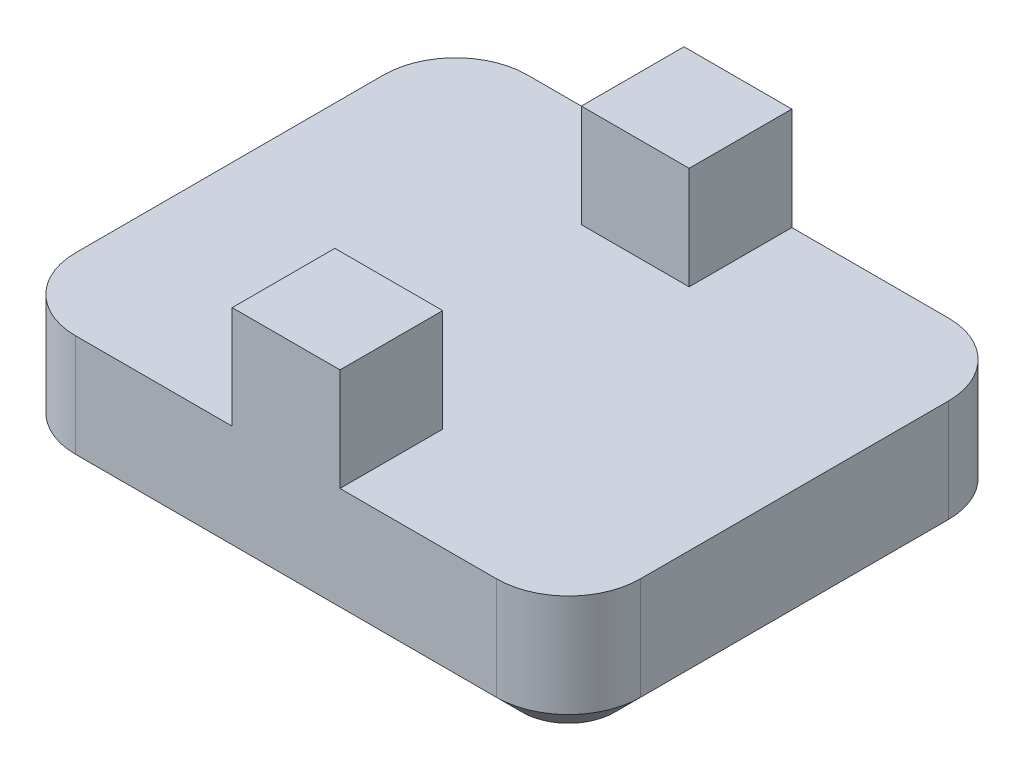
ISO-10303-21;
HEADER;
FILE_DESCRIPTION(('STEP AP214'),'2;1');
FILE_NAME('part.step','',(''),(''),'','','');
FILE_SCHEMA(('AUTOMOTIVE_DESIGN { 1 0 10303 214 1 1 1 1 }'));
ENDSEC;
DATA;
#1=APPLICATION_CONTEXT('core data for automotive mechanical design processes');
#2=APPLICATION_PROTOCOL_DEFINITION('international standard','automotive_design',2000,#1);
#3=PRODUCT_CONTEXT('',#1,'mechanical');
#4=PRODUCT('Part','Part','',(#3));
#5=PRODUCT_RELATED_PRODUCT_CATEGORY('part','',(#4));
#6=PRODUCT_DEFINITION_FORMATION('','',#4);
#7=PRODUCT_DEFINITION_CONTEXT('part definition',#1,'design');
#8=PRODUCT_DEFINITION('design','',#6,#7);
#9=PRODUCT_DEFINITION_SHAPE('','',#8);
#10=(LENGTH_UNIT() NAMED_UNIT(*) SI_UNIT(.MILLI.,.METRE.));
#11=(NAMED_UNIT(*) PLANE_ANGLE_UNIT() SI_UNIT($,.RADIAN.));
#12=(NAMED_UNIT(*) SI_UNIT($,.STERADIAN.) SOLID_ANGLE_UNIT());
#13=UNCERTAINTY_MEASURE_WITH_UNIT(LENGTH_MEASURE(1.E-05),#10,'distance_accuracy_value','');
#14=(GEOMETRIC_REPRESENTATION_CONTEXT(3) GLOBAL_UNCERTAINTY_ASSIGNED_CONTEXT((#13)) GLOBAL_UNIT_ASSIGNED_CONTEXT((#10,
#11,#12)) REPRESENTATION_CONTEXT('',''));
#15=CARTESIAN_POINT('',(0.,0.,0.));
#16=DIRECTION('',(0.,0.,1.));
#17=DIRECTION('',(1.,0.,0.));
#18=AXIS2_PLACEMENT_3D('',#15,#16,#17);
#19=CARTESIAN_POINT('',(-44.9928014289941,2.5,14.3871731803003));
#20=DIRECTION('',(0.,-1.,0.));
#21=DIRECTION('',(0.,0.,-1.));
#22=AXIS2_PLACEMENT_3D('',#19,#20,#21);
#23=CYLINDRICAL_SURFACE('',#22,1.4);
#24=DIRECTION('',(0.,-1.,0.));
#25=VECTOR('',#24,1.);
#26=CARTESIAN_POINT('',(-44.9928014289941,2.5,15.7871731803003));
#27=LINE('',#26,#25);
#28=CARTESIAN_POINT('',(-44.9928014289941,2.5,15.7871731803003));
#29=VERTEX_POINT('',#28);
#30=CARTESIAN_POINT('',(-44.9928014289941,0.5,15.7871731803003));
#31=VERTEX_POINT('',#30);
#32=EDGE_CURVE('E258',#29,#31,#27,.T.);
#33=ORIENTED_EDGE('',*,*,#32,.T.);
#34=CARTESIAN_POINT('',(-44.9928014289941,0.5,14.3871731803003));
#35=DIRECTION('',(0.,1.,0.));
#36=DIRECTION('',(0.,0.,1.));
#37=AXIS2_PLACEMENT_3D('',#34,#35,#36);
#38=CIRCLE('',#37,1.4);
#39=CARTESIAN_POINT('',(-43.5928014289941,0.5,14.3871731803003));
#40=VERTEX_POINT('',#39);
#41=EDGE_CURVE('E53',#31,#40,#38,.T.);
#42=ORIENTED_EDGE('',*,*,#41,.T.);
#43=DIRECTION('',(0.,-1.,0.));
#44=VECTOR('',#43,1.);
#45=CARTESIAN_POINT('',(-43.5928014289941,2.5,14.3871731803003));
#46=LINE('',#45,#44);
#47=CARTESIAN_POINT('',(-43.5928014289941,2.5,14.3871731803003));
#48=VERTEX_POINT('',#47);
#49=EDGE_CURVE('E279',#48,#40,#46,.T.);
#50=ORIENTED_EDGE('',*,*,#49,.F.);
#51=CARTESIAN_POINT('',(-44.9928014289941,2.5,14.3871731803003));
#52=DIRECTION('',(0.,1.,0.));
#53=DIRECTION('',(0.,0.,1.));
#54=AXIS2_PLACEMENT_3D('',#51,#52,#53);
#55=CIRCLE('',#54,1.4);
#56=EDGE_CURVE('E239',#29,#48,#55,.T.);
#57=ORIENTED_EDGE('',*,*,#56,.F.);
#58=EDGE_LOOP('',(#33,#42,#50,#57));
#59=FACE_BOUND('',#58,.T.);
#60=ADVANCED_FACE('F43',(#59),#23,.T.);
#61=CARTESIAN_POINT('',(-43.592801428994,2.5,8.38717318030035));
#62=DIRECTION('',(-1.,0.,0.));
#63=DIRECTION('',(0.,0.,1.));
#64=AXIS2_PLACEMENT_3D('',#61,#62,#63);
#65=PLANE('',#64);
#66=ORIENTED_EDGE('',*,*,#49,.T.);
#67=DIRECTION('',(0.,0.,-1.));
#68=VECTOR('',#67,1.);
#69=CARTESIAN_POINT('',(-43.592801428994,0.5,8.38717318030035));
#70=LINE('',#69,#68);
#71=CARTESIAN_POINT('',(-43.592801428994,0.5,8.38717318030035));
#72=VERTEX_POINT('',#71);
#73=EDGE_CURVE('E308',#40,#72,#70,.T.);
#74=ORIENTED_EDGE('',*,*,#73,.T.);
#75=DIRECTION('',(0.,-1.,0.));
#76=VECTOR('',#75,1.);
#77=CARTESIAN_POINT('',(-43.592801428994,2.5,8.38717318030035));
#78=LINE('',#77,#76);
#79=CARTESIAN_POINT('',(-43.592801428994,2.5,8.38717318030035));
#80=VERTEX_POINT('',#79);
#81=EDGE_CURVE('E276',#80,#72,#78,.T.);
#82=ORIENTED_EDGE('',*,*,#81,.F.);
#83=DIRECTION('',(0.,0.,-1.));
#84=VECTOR('',#83,1.);
#85=CARTESIAN_POINT('',(-43.592801428994,2.5,8.38717318030035));
#86=LINE('',#85,#84);
#87=EDGE_CURVE('E242',#48,#80,#86,.T.);
#88=ORIENTED_EDGE('',*,*,#87,.F.);
#89=EDGE_LOOP('',(#66,#74,#82,#88));
#90=FACE_BOUND('',#89,.T.);
#91=ADVANCED_FACE('F414',(#90),#65,.F.);
#92=CARTESIAN_POINT('',(-44.992801428994,2.5,8.38717318030035));
#93=DIRECTION('',(0.,-1.,0.));
#94=DIRECTION('',(0.,0.,-1.));
#95=AXIS2_PLACEMENT_3D('',#92,#93,#94);
#96=CYLINDRICAL_SURFACE('',#95,1.4);
#97=ORIENTED_EDGE('',*,*,#81,.T.);
#98=CARTESIAN_POINT('',(-44.992801428994,0.5,8.38717318030035));
#99=DIRECTION('',(0.,1.,0.));
#100=DIRECTION('',(0.,0.,1.));
#101=AXIS2_PLACEMENT_3D('',#98,#99,#100);
#102=CIRCLE('',#101,1.4);
#103=CARTESIAN_POINT('',(-44.992801428994,0.5,6.98717318030034));
#104=VERTEX_POINT('',#103);
#105=EDGE_CURVE('E304',#72,#104,#102,.T.);
#106=ORIENTED_EDGE('',*,*,#105,.T.);
#107=DIRECTION('',(0.,-1.,0.));
#108=VECTOR('',#107,1.);
#109=CARTESIAN_POINT('',(-44.992801428994,2.5,6.98717318030034));
#110=LINE('',#109,#108);
#111=CARTESIAN_POINT('',(-44.992801428994,2.5,6.98717318030034));
#112=VERTEX_POINT('',#111);
#113=EDGE_CURVE('E273',#112,#104,#110,.T.);
#114=ORIENTED_EDGE('',*,*,#113,.F.);
#115=CARTESIAN_POINT('',(-44.992801428994,2.5,8.38717318030035));
#116=DIRECTION('',(0.,1.,0.));
#117=DIRECTION('',(0.,0.,-1.));
#118=AXIS2_PLACEMENT_3D('',#115,#116,#117);
#119=CIRCLE('',#118,1.4);
#120=EDGE_CURVE('E244',#80,#112,#119,.T.);
#121=ORIENTED_EDGE('',*,*,#120,.F.);
#122=EDGE_LOOP('',(#97,#106,#114,#121));
#123=FACE_BOUND('',#122,.T.);
#124=ADVANCED_FACE('F357',(#123),#96,.T.);
#125=CARTESIAN_POINT('',(-53.192801428994,2.5,6.98717318030034));
#126=DIRECTION('',(0.,0.,1.));
#127=DIRECTION('',(1.,0.,0.));
#128=AXIS2_PLACEMENT_3D('',#125,#126,#127);
#129=PLANE('',#128);
#130=ORIENTED_EDGE('',*,*,#113,.T.);
#131=DIRECTION('',(-1.,0.,0.));
#132=VECTOR('',#131,1.);
#133=CARTESIAN_POINT('',(-53.192801428994,0.5,6.98717318030034));
#134=LINE('',#133,#132);
#135=CARTESIAN_POINT('',(-53.192801428994,0.5,6.98717318030035));
#136=VERTEX_POINT('',#135);
#137=EDGE_CURVE('E282',#104,#136,#134,.T.);
#138=ORIENTED_EDGE('',*,*,#137,.T.);
#139=DIRECTION('',(0.,-1.,0.));
#140=VECTOR('',#139,1.);
#141=CARTESIAN_POINT('',(-53.192801428994,2.5,6.98717318030035));
#142=LINE('',#141,#140);
#143=CARTESIAN_POINT('',(-53.192801428994,2.5,6.98717318030035));
#144=VERTEX_POINT('',#143);
#145=EDGE_CURVE('E270',#144,#136,#142,.T.);
#146=ORIENTED_EDGE('',*,*,#145,.F.);
#147=DIRECTION('',(-1.,0.,0.));
#148=VECTOR('',#147,1.);
#149=CARTESIAN_POINT('',(-53.192801428994,2.5,6.98717318030034));
#150=LINE('',#149,#148);
#151=CARTESIAN_POINT('',(-50.142801428994,2.5,6.98717318030034));
#152=VERTEX_POINT('',#151);
#153=EDGE_CURVE('E246',#152,#144,#150,.T.);
#154=ORIENTED_EDGE('',*,*,#153,.F.);
#155=DIRECTION('',(0.,-1.,0.));
#156=VECTOR('',#155,1.);
#157=CARTESIAN_POINT('',(-50.142801428994,4.5,6.98717318030035));
#158=LINE('',#157,#156);
#159=CARTESIAN_POINT('',(-50.142801428994,4.5,6.98717318030035));
#160=VERTEX_POINT('',#159);
#161=EDGE_CURVE('E374',#160,#152,#158,.T.);
#162=ORIENTED_EDGE('',*,*,#161,.F.);
#163=DIRECTION('',(-1.,0.,0.));
#164=VECTOR('',#163,1.);
#165=CARTESIAN_POINT('',(-50.142801428994,4.5,6.98717318030035));
#166=LINE('',#165,#164);
#167=CARTESIAN_POINT('',(-48.042801428994,4.5,6.98717318030035));
#168=VERTEX_POINT('',#167);
#169=EDGE_CURVE('E196',#168,#160,#166,.T.);
#170=ORIENTED_EDGE('',*,*,#169,.F.);
#171=DIRECTION('',(0.,-1.,0.));
#172=VECTOR('',#171,1.);
#173=CARTESIAN_POINT('',(-48.042801428994,4.5,6.98717318030035));
#174=LINE('',#173,#172);
#175=CARTESIAN_POINT('',(-48.042801428994,2.5,6.98717318030034));
#176=VERTEX_POINT('',#175);
#177=EDGE_CURVE('E208',#168,#176,#174,.T.);
#178=ORIENTED_EDGE('',*,*,#177,.T.);
#179=EDGE_CURVE('E247',#112,#176,#150,.T.);
#180=ORIENTED_EDGE('',*,*,#179,.F.);
#181=EDGE_LOOP('',(#130,#138,#146,#154,#162,#170,#178,#180));
#182=FACE_BOUND('',#181,.T.);
#183=ADVANCED_FACE('F362',(#182),#129,.F.);
#184=CARTESIAN_POINT('',(-53.192801428994,2.5,8.38717318030035));
#185=DIRECTION('',(0.,-1.,0.));
#186=DIRECTION('',(0.,0.,-1.));
#187=AXIS2_PLACEMENT_3D('',#184,#185,#186);
#188=CYLINDRICAL_SURFACE('',#187,1.4);
#189=ORIENTED_EDGE('',*,*,#145,.T.);
#190=CARTESIAN_POINT('',(-53.192801428994,0.5,8.38717318030035));
#191=DIRECTION('',(0.,1.,0.));
#192=DIRECTION('',(0.,0.,1.));
#193=AXIS2_PLACEMENT_3D('',#190,#191,#192);
#194=CIRCLE('',#193,1.4);
#195=CARTESIAN_POINT('',(-54.592801428994,0.5,8.38717318030035));
#196=VERTEX_POINT('',#195);
#197=EDGE_CURVE('E302',#136,#196,#194,.T.);
#198=ORIENTED_EDGE('',*,*,#197,.T.);
#199=DIRECTION('',(0.,-1.,0.));
#200=VECTOR('',#199,1.);
#201=CARTESIAN_POINT('',(-54.592801428994,2.5,8.38717318030035));
#202=LINE('',#201,#200);
#203=CARTESIAN_POINT('',(-54.592801428994,2.5,8.38717318030035));
#204=VERTEX_POINT('',#203);
#205=EDGE_CURVE('E267',#204,#196,#202,.T.);
#206=ORIENTED_EDGE('',*,*,#205,.F.);
#207=CARTESIAN_POINT('',(-53.192801428994,2.5,8.38717318030035));
#208=DIRECTION('',(0.,1.,0.));
#209=DIRECTION('',(0.,0.,1.));
#210=AXIS2_PLACEMENT_3D('',#207,#208,#209);
#211=CIRCLE('',#210,1.4);
#212=EDGE_CURVE('E249',#144,#204,#211,.T.);
#213=ORIENTED_EDGE('',*,*,#212,.F.);
#214=EDGE_LOOP('',(#189,#198,#206,#213));
#215=FACE_BOUND('',#214,.T.);
#216=ADVANCED_FACE('F383',(#215),#188,.T.);
#217=CARTESIAN_POINT('',(-54.592801428994,2.5,8.38717318030035));
#218=DIRECTION('',(1.,0.,0.));
#219=DIRECTION('',(0.,0.,-1.));
#220=AXIS2_PLACEMENT_3D('',#217,#218,#219);
#221=PLANE('',#220);
#222=ORIENTED_EDGE('',*,*,#205,.T.);
#223=DIRECTION('',(0.,0.,1.));
#224=VECTOR('',#223,1.);
#225=CARTESIAN_POINT('',(-54.592801428994,0.5,8.38717318030035));
#226=LINE('',#225,#224);
#227=CARTESIAN_POINT('',(-54.5928014289941,0.5,14.3871731803003));
#228=VERTEX_POINT('',#227);
#229=EDGE_CURVE('E306',#196,#228,#226,.T.);
#230=ORIENTED_EDGE('',*,*,#229,.T.);
#231=DIRECTION('',(0.,-1.,0.));
#232=VECTOR('',#231,1.);
#233=CARTESIAN_POINT('',(-54.5928014289941,2.5,14.3871731803003));
#234=LINE('',#233,#232);
#235=CARTESIAN_POINT('',(-54.5928014289941,2.5,14.3871731803003));
#236=VERTEX_POINT('',#235);
#237=EDGE_CURVE('E264',#236,#228,#234,.T.);
#238=ORIENTED_EDGE('',*,*,#237,.F.);
#239=DIRECTION('',(0.,0.,1.));
#240=VECTOR('',#239,1.);
#241=CARTESIAN_POINT('',(-54.592801428994,2.5,8.38717318030035));
#242=LINE('',#241,#240);
#243=EDGE_CURVE('E251',#204,#236,#242,.T.);
#244=ORIENTED_EDGE('',*,*,#243,.F.);
#245=EDGE_LOOP('',(#222,#230,#238,#244));
#246=FACE_BOUND('',#245,.T.);
#247=ADVANCED_FACE('F387',(#246),#221,.F.);
#248=CARTESIAN_POINT('',(-53.1928014289941,2.5,14.3871731803003));
#249=DIRECTION('',(0.,-1.,0.));
#250=DIRECTION('',(0.,0.,-1.));
#251=AXIS2_PLACEMENT_3D('',#248,#249,#250);
#252=CYLINDRICAL_SURFACE('',#251,1.4);
#253=ORIENTED_EDGE('',*,*,#237,.T.);
#254=CARTESIAN_POINT('',(-53.1928014289941,0.5,14.3871731803003));
#255=DIRECTION('',(0.,1.,0.));
#256=DIRECTION('',(0.,0.,1.));
#257=AXIS2_PLACEMENT_3D('',#254,#255,#256);
#258=CIRCLE('',#257,1.4);
#259=CARTESIAN_POINT('',(-53.1928014289941,0.5,15.7871731803003));
#260=VERTEX_POINT('',#259);
#261=EDGE_CURVE('E310',#228,#260,#258,.T.);
#262=ORIENTED_EDGE('',*,*,#261,.T.);
#263=DIRECTION('',(0.,-1.,0.));
#264=VECTOR('',#263,1.);
#265=CARTESIAN_POINT('',(-53.1928014289941,2.5,15.7871731803003));
#266=LINE('',#265,#264);
#267=CARTESIAN_POINT('',(-53.1928014289941,2.5,15.7871731803003));
#268=VERTEX_POINT('',#267);
#269=EDGE_CURVE('E261',#268,#260,#266,.T.);
#270=ORIENTED_EDGE('',*,*,#269,.F.);
#271=CARTESIAN_POINT('',(-53.1928014289941,2.5,14.3871731803003));
#272=DIRECTION('',(0.,1.,0.));
#273=DIRECTION('',(0.,0.,1.));
#274=AXIS2_PLACEMENT_3D('',#271,#272,#273);
#275=CIRCLE('',#274,1.4);
#276=EDGE_CURVE('E253',#236,#268,#275,.T.);
#277=ORIENTED_EDGE('',*,*,#276,.F.);
#278=EDGE_LOOP('',(#253,#262,#270,#277));
#279=FACE_BOUND('',#278,.T.);
#280=ADVANCED_FACE('F391',(#279),#252,.T.);
#281=CARTESIAN_POINT('',(-53.1928014289941,2.5,15.7871731803003));
#282=DIRECTION('',(0.,0.,-1.));
#283=DIRECTION('',(-1.,0.,0.));
#284=AXIS2_PLACEMENT_3D('',#281,#282,#283);
#285=PLANE('',#284);
#286=ORIENTED_EDGE('',*,*,#269,.T.);
#287=DIRECTION('',(1.,0.,0.));
#288=VECTOR('',#287,1.);
#289=CARTESIAN_POINT('',(-53.1928014289941,0.5,15.7871731803003));
#290=LINE('',#289,#288);
#291=EDGE_CURVE('E11',#260,#31,#290,.T.);
#292=ORIENTED_EDGE('',*,*,#291,.T.);
#293=ORIENTED_EDGE('',*,*,#32,.F.);
#294=DIRECTION('',(1.,0.,0.));
#295=VECTOR('',#294,1.);
#296=CARTESIAN_POINT('',(-53.1928014289941,2.5,15.7871731803003));
#297=LINE('',#296,#295);
#298=CARTESIAN_POINT('',(-48.042801428994,2.5,15.7871731803003));
#299=VERTEX_POINT('',#298);
#300=EDGE_CURVE('E255',#299,#29,#297,.T.);
#301=ORIENTED_EDGE('',*,*,#300,.F.);
#302=DIRECTION('',(0.,-1.,0.));
#303=VECTOR('',#302,1.);
#304=CARTESIAN_POINT('',(-48.0428014289941,4.5,15.7871731803003));
#305=LINE('',#304,#303);
#306=CARTESIAN_POINT('',(-48.0428014289941,4.5,15.7871731803003));
#307=VERTEX_POINT('',#306);
#308=EDGE_CURVE('E215',#307,#299,#305,.T.);
#309=ORIENTED_EDGE('',*,*,#308,.F.);
#310=DIRECTION('',(1.,0.,0.));
#311=VECTOR('',#310,1.);
#312=CARTESIAN_POINT('',(-50.1428014289941,4.5,15.7871731803003));
#313=LINE('',#312,#311);
#314=CARTESIAN_POINT('',(-50.1428014289941,4.5,15.7871731803003));
#315=VERTEX_POINT('',#314);
#316=EDGE_CURVE('E235',#315,#307,#313,.T.);
#317=ORIENTED_EDGE('',*,*,#316,.F.);
#318=DIRECTION('',(0.,-1.,0.));
#319=VECTOR('',#318,1.);
#320=CARTESIAN_POINT('',(-50.1428014289941,4.5,15.7871731803003));
#321=LINE('',#320,#319);
#322=CARTESIAN_POINT('',(-50.142801428994,2.5,15.7871731803003));
#323=VERTEX_POINT('',#322);
#324=EDGE_CURVE('E212',#315,#323,#321,.T.);
#325=ORIENTED_EDGE('',*,*,#324,.T.);
#326=EDGE_CURVE('E256',#268,#323,#297,.T.);
#327=ORIENTED_EDGE('',*,*,#326,.F.);
#328=EDGE_LOOP('',(#286,#292,#293,#301,#309,#317,#325,#327));
#329=FACE_BOUND('',#328,.T.);
#330=ADVANCED_FACE('F395',(#329),#285,.F.);
#331=CARTESIAN_POINT('',(-44.9928014289941,2.5,14.3871731803003));
#332=DIRECTION('',(0.,1.,0.));
#333=DIRECTION('',(0.,0.,1.));
#334=AXIS2_PLACEMENT_3D('',#331,#332,#333);
#335=PLANE('',#334);
#336=DIRECTION('',(0.,0.,1.));
#337=VECTOR('',#336,1.);
#338=CARTESIAN_POINT('',(-50.142801428994,2.5,6.98717318030035));
#339=LINE('',#338,#337);
#340=CARTESIAN_POINT('',(-50.142801428994,2.5,8.98717318030035));
#341=VERTEX_POINT('',#340);
#342=EDGE_CURVE('E203',#152,#341,#339,.T.);
#343=ORIENTED_EDGE('',*,*,#342,.F.);
#344=ORIENTED_EDGE('',*,*,#153,.T.);
#345=ORIENTED_EDGE('',*,*,#212,.T.);
#346=ORIENTED_EDGE('',*,*,#243,.T.);
#347=ORIENTED_EDGE('',*,*,#276,.T.);
#348=ORIENTED_EDGE('',*,*,#326,.T.);
#349=DIRECTION('',(0.,0.,1.));
#350=VECTOR('',#349,1.);
#351=CARTESIAN_POINT('',(-50.142801428994,2.5,13.7871731803003));
#352=LINE('',#351,#350);
#353=CARTESIAN_POINT('',(-50.142801428994,2.5,13.7871731803003));
#354=VERTEX_POINT('',#353);
#355=EDGE_CURVE('E68',#354,#323,#352,.T.);
#356=ORIENTED_EDGE('',*,*,#355,.F.);
#357=DIRECTION('',(-1.,0.,0.));
#358=VECTOR('',#357,1.);
#359=CARTESIAN_POINT('',(-50.142801428994,2.5,13.7871731803003));
#360=LINE('',#359,#358);
#361=CARTESIAN_POINT('',(-48.042801428994,2.5,13.7871731803003));
#362=VERTEX_POINT('',#361);
#363=EDGE_CURVE('E225',#362,#354,#360,.T.);
#364=ORIENTED_EDGE('',*,*,#363,.F.);
#365=DIRECTION('',(0.,0.,-1.));
#366=VECTOR('',#365,1.);
#367=CARTESIAN_POINT('',(-48.042801428994,2.5,13.7871731803003));
#368=LINE('',#367,#366);
#369=EDGE_CURVE('E227',#299,#362,#368,.T.);
#370=ORIENTED_EDGE('',*,*,#369,.F.);
#371=ORIENTED_EDGE('',*,*,#300,.T.);
#372=ORIENTED_EDGE('',*,*,#56,.T.);
#373=ORIENTED_EDGE('',*,*,#87,.T.);
#374=ORIENTED_EDGE('',*,*,#120,.T.);
#375=ORIENTED_EDGE('',*,*,#179,.T.);
#376=DIRECTION('',(0.,0.,-1.));
#377=VECTOR('',#376,1.);
#378=CARTESIAN_POINT('',(-48.042801428994,2.5,6.98717318030035));
#379=LINE('',#378,#377);
#380=CARTESIAN_POINT('',(-48.042801428994,2.5,8.98717318030035));
#381=VERTEX_POINT('',#380);
#382=EDGE_CURVE('E200',#381,#176,#379,.T.);
#383=ORIENTED_EDGE('',*,*,#382,.F.);
#384=DIRECTION('',(1.,0.,0.));
#385=VECTOR('',#384,1.);
#386=CARTESIAN_POINT('',(-50.142801428994,2.5,8.98717318030035));
#387=LINE('',#386,#385);
#388=EDGE_CURVE('E61',#341,#381,#387,.T.);
#389=ORIENTED_EDGE('',*,*,#388,.F.);
#390=EDGE_LOOP('',(#343,#344,#345,#346,#347,#348,#356,#364,#370,#371,#372,#373,#374,#375,#383,#389));
#391=FACE_BOUND('',#390,.T.);
#392=ADVANCED_FACE('F367',(#391),#335,.T.);
#393=CARTESIAN_POINT('',(-44.9928014289941,0.,14.3871731803003));
#394=DIRECTION('',(0.,1.,0.));
#395=DIRECTION('',(0.,0.,1.));
#396=AXIS2_PLACEMENT_3D('',#393,#394,#395);
#397=PLANE('',#396);
#398=CARTESIAN_POINT('',(-53.192801428994,0.,8.38717318030035));
#399=DIRECTION('',(0.,1.,0.));
#400=DIRECTION('',(0.,0.,1.));
#401=AXIS2_PLACEMENT_3D('',#398,#399,#400);
#402=CIRCLE('',#401,0.899999999999997);
#403=CARTESIAN_POINT('',(-54.092801428994,0.,8.38717318030035));
#404=VERTEX_POINT('',#403);
#405=CARTESIAN_POINT('',(-53.192801428994,0.,7.48717318030035));
#406=VERTEX_POINT('',#405);
#407=EDGE_CURVE('E297',#404,#406,#402,.F.);
#408=ORIENTED_EDGE('',*,*,#407,.T.);
#409=DIRECTION('',(1.,0.,0.));
#410=VECTOR('',#409,1.);
#411=CARTESIAN_POINT('',(-44.9928014289941,0.,7.48717318030035));
#412=LINE('',#411,#410);
#413=CARTESIAN_POINT('',(-44.992801428994,0.,7.48717318030035));
#414=VERTEX_POINT('',#413);
#415=EDGE_CURVE('E299',#406,#414,#412,.T.);
#416=ORIENTED_EDGE('',*,*,#415,.T.);
#417=CARTESIAN_POINT('',(-44.992801428994,0.,8.38717318030035));
#418=DIRECTION('',(0.,1.,0.));
#419=DIRECTION('',(0.,0.,1.));
#420=AXIS2_PLACEMENT_3D('',#417,#418,#419);
#421=CIRCLE('',#420,0.899999999999998);
#422=CARTESIAN_POINT('',(-44.092801428994,0.,8.38717318030035));
#423=VERTEX_POINT('',#422);
#424=EDGE_CURVE('E295',#414,#423,#421,.F.);
#425=ORIENTED_EDGE('',*,*,#424,.T.);
#426=DIRECTION('',(0.,0.,1.));
#427=VECTOR('',#426,1.);
#428=CARTESIAN_POINT('',(-44.0928014289941,0.,14.3871731803003));
#429=LINE('',#428,#427);
#430=CARTESIAN_POINT('',(-44.0928014289941,0.,14.3871731803003));
#431=VERTEX_POINT('',#430);
#432=EDGE_CURVE('E291',#423,#431,#429,.T.);
#433=ORIENTED_EDGE('',*,*,#432,.T.);
#434=CARTESIAN_POINT('',(-44.9928014289941,0.,14.3871731803003));
#435=DIRECTION('',(0.,1.,0.));
#436=DIRECTION('',(0.,0.,1.));
#437=AXIS2_PLACEMENT_3D('',#434,#435,#436);
#438=CIRCLE('',#437,0.899999999999998);
#439=CARTESIAN_POINT('',(-44.9928014289941,0.,15.2871731803003));
#440=VERTEX_POINT('',#439);
#441=EDGE_CURVE('E287',#431,#440,#438,.F.);
#442=ORIENTED_EDGE('',*,*,#441,.T.);
#443=DIRECTION('',(-1.,0.,0.));
#444=VECTOR('',#443,1.);
#445=CARTESIAN_POINT('',(-44.9928014289941,0.,15.2871731803003));
#446=LINE('',#445,#444);
#447=CARTESIAN_POINT('',(-53.1928014289941,0.,15.2871731803003));
#448=VERTEX_POINT('',#447);
#449=EDGE_CURVE('E285',#440,#448,#446,.T.);
#450=ORIENTED_EDGE('',*,*,#449,.T.);
#451=CARTESIAN_POINT('',(-53.1928014289941,0.,14.3871731803003));
#452=DIRECTION('',(0.,1.,0.));
#453=DIRECTION('',(0.,0.,1.));
#454=AXIS2_PLACEMENT_3D('',#451,#452,#453);
#455=CIRCLE('',#454,0.899999999999998);
#456=CARTESIAN_POINT('',(-54.0928014289941,0.,14.3871731803003));
#457=VERTEX_POINT('',#456);
#458=EDGE_CURVE('E289',#448,#457,#455,.F.);
#459=ORIENTED_EDGE('',*,*,#458,.T.);
#460=DIRECTION('',(0.,0.,-1.));
#461=VECTOR('',#460,1.);
#462=CARTESIAN_POINT('',(-54.0928014289941,0.,14.3871731803002));
#463=LINE('',#462,#461);
#464=EDGE_CURVE('E293',#457,#404,#463,.T.);
#465=ORIENTED_EDGE('',*,*,#464,.T.);
#466=EDGE_LOOP('',(#408,#416,#425,#433,#442,#450,#459,#465));
#467=FACE_BOUND('',#466,.T.);
#468=ADVANCED_FACE('F342',(#467),#397,.F.);
#469=CARTESIAN_POINT('',(-53.1928014289941,0.5,15.7871731803003));
#470=DIRECTION('',(0.,0.707106781186549,-0.707106781186546));
#471=DIRECTION('',(1.,0.,0.));
#472=AXIS2_PLACEMENT_3D('',#469,#470,#471);
#473=PLANE('',#472);
#474=DIRECTION('',(0.,0.707106781186546,0.707106781186549));
#475=VECTOR('',#474,1.);
#476=CARTESIAN_POINT('',(-53.1928014289941,0.,15.2871731803003));
#477=LINE('',#476,#475);
#478=EDGE_CURVE('E325',#448,#260,#477,.T.);
#479=ORIENTED_EDGE('',*,*,#478,.F.);
#480=ORIENTED_EDGE('',*,*,#449,.F.);
#481=DIRECTION('',(0.,-0.707106781186546,-0.707106781186549));
#482=VECTOR('',#481,1.);
#483=CARTESIAN_POINT('',(-44.9928014289941,0.5,15.7871731803003));
#484=LINE('',#483,#482);
#485=EDGE_CURVE('E48',#31,#440,#484,.T.);
#486=ORIENTED_EDGE('',*,*,#485,.F.);
#487=ORIENTED_EDGE('',*,*,#291,.F.);
#488=EDGE_LOOP('',(#479,#480,#486,#487));
#489=FACE_BOUND('',#488,.T.);
#490=ADVANCED_FACE('F46',(#489),#473,.F.);
#491=CARTESIAN_POINT('',(-44.9928014289941,0.5,14.3871731803003));
#492=DIRECTION('',(0.,1.,0.));
#493=DIRECTION('',(0.,0.,1.));
#494=AXIS2_PLACEMENT_3D('',#491,#492,#493);
#495=CONICAL_SURFACE('',#494,1.4,0.785398163397449);
#496=ORIENTED_EDGE('',*,*,#485,.T.);
#497=ORIENTED_EDGE('',*,*,#441,.F.);
#498=DIRECTION('',(-0.707106781186547,-0.707106781186547,0.));
#499=VECTOR('',#498,1.);
#500=CARTESIAN_POINT('',(-43.5928014289941,0.5,14.3871731803003));
#501=LINE('',#500,#499);
#502=EDGE_CURVE('E323',#40,#431,#501,.T.);
#503=ORIENTED_EDGE('',*,*,#502,.F.);
#504=ORIENTED_EDGE('',*,*,#41,.F.);
#505=EDGE_LOOP('',(#496,#497,#503,#504));
#506=FACE_BOUND('',#505,.T.);
#507=ADVANCED_FACE('F336',(#506),#495,.T.);
#508=CARTESIAN_POINT('',(-53.1928014289941,0.5,14.3871731803003));
#509=DIRECTION('',(0.,1.,0.));
#510=DIRECTION('',(0.,0.,1.));
#511=AXIS2_PLACEMENT_3D('',#508,#509,#510);
#512=CONICAL_SURFACE('',#511,1.4,0.785398163397449);
#513=ORIENTED_EDGE('',*,*,#478,.T.);
#514=ORIENTED_EDGE('',*,*,#261,.F.);
#515=DIRECTION('',(-0.707106781186547,0.707106781186547,0.));
#516=VECTOR('',#515,1.);
#517=CARTESIAN_POINT('',(-54.0928014289941,0.,14.3871731803003));
#518=LINE('',#517,#516);
#519=EDGE_CURVE('E320',#457,#228,#518,.T.);
#520=ORIENTED_EDGE('',*,*,#519,.F.);
#521=ORIENTED_EDGE('',*,*,#458,.F.);
#522=EDGE_LOOP('',(#513,#514,#520,#521));
#523=FACE_BOUND('',#522,.T.);
#524=ADVANCED_FACE('F457',(#523),#512,.T.);
#525=CARTESIAN_POINT('',(-43.592801428994,0.5,8.38717318030035));
#526=DIRECTION('',(-0.707106781186547,0.707106781186547,0.));
#527=DIRECTION('',(0.,0.,-1.));
#528=AXIS2_PLACEMENT_3D('',#525,#526,#527);
#529=PLANE('',#528);
#530=ORIENTED_EDGE('',*,*,#502,.T.);
#531=ORIENTED_EDGE('',*,*,#432,.F.);
#532=DIRECTION('',(-0.707106781186547,-0.707106781186547,0.));
#533=VECTOR('',#532,1.);
#534=CARTESIAN_POINT('',(-43.592801428994,0.5,8.38717318030035));
#535=LINE('',#534,#533);
#536=EDGE_CURVE('E317',#72,#423,#535,.T.);
#537=ORIENTED_EDGE('',*,*,#536,.F.);
#538=ORIENTED_EDGE('',*,*,#73,.F.);
#539=EDGE_LOOP('',(#530,#531,#537,#538));
#540=FACE_BOUND('',#539,.T.);
#541=ADVANCED_FACE('F348',(#540),#529,.F.);
#542=CARTESIAN_POINT('',(-54.592801428994,0.5,8.38717318030035));
#543=DIRECTION('',(0.707106781186547,0.707106781186547,0.));
#544=DIRECTION('',(0.,0.,1.));
#545=AXIS2_PLACEMENT_3D('',#542,#543,#544);
#546=PLANE('',#545);
#547=ORIENTED_EDGE('',*,*,#519,.T.);
#548=ORIENTED_EDGE('',*,*,#229,.F.);
#549=DIRECTION('',(-0.707106781186547,0.707106781186547,0.));
#550=VECTOR('',#549,1.);
#551=CARTESIAN_POINT('',(-54.092801428994,0.,8.38717318030035));
#552=LINE('',#551,#550);
#553=EDGE_CURVE('E314',#404,#196,#552,.T.);
#554=ORIENTED_EDGE('',*,*,#553,.F.);
#555=ORIENTED_EDGE('',*,*,#464,.F.);
#556=EDGE_LOOP('',(#547,#548,#554,#555));
#557=FACE_BOUND('',#556,.T.);
#558=ADVANCED_FACE('F445',(#557),#546,.F.);
#559=CARTESIAN_POINT('',(-44.992801428994,0.5,8.38717318030035));
#560=DIRECTION('',(0.,1.,0.));
#561=DIRECTION('',(0.,0.,1.));
#562=AXIS2_PLACEMENT_3D('',#559,#560,#561);
#563=CONICAL_SURFACE('',#562,1.4,0.785398163397449);
#564=ORIENTED_EDGE('',*,*,#536,.T.);
#565=ORIENTED_EDGE('',*,*,#424,.F.);
#566=DIRECTION('',(0.,-0.707106781186547,0.707106781186548));
#567=VECTOR('',#566,1.);
#568=CARTESIAN_POINT('',(-44.992801428994,0.5,6.98717318030035));
#569=LINE('',#568,#567);
#570=EDGE_CURVE('E206',#104,#414,#569,.T.);
#571=ORIENTED_EDGE('',*,*,#570,.F.);
#572=ORIENTED_EDGE('',*,*,#105,.F.);
#573=EDGE_LOOP('',(#564,#565,#571,#572));
#574=FACE_BOUND('',#573,.T.);
#575=ADVANCED_FACE('F352',(#574),#563,.T.);
#576=CARTESIAN_POINT('',(-53.192801428994,0.5,8.38717318030035));
#577=DIRECTION('',(0.,1.,0.));
#578=DIRECTION('',(0.,0.,1.));
#579=AXIS2_PLACEMENT_3D('',#576,#577,#578);
#580=CONICAL_SURFACE('',#579,1.4,0.78539816339745);
#581=ORIENTED_EDGE('',*,*,#553,.T.);
#582=ORIENTED_EDGE('',*,*,#197,.F.);
#583=DIRECTION('',(0.,0.707106781186546,-0.707106781186549));
#584=VECTOR('',#583,1.);
#585=CARTESIAN_POINT('',(-53.192801428994,0.,7.48717318030035));
#586=LINE('',#585,#584);
#587=EDGE_CURVE('E204',#406,#136,#586,.T.);
#588=ORIENTED_EDGE('',*,*,#587,.F.);
#589=ORIENTED_EDGE('',*,*,#407,.F.);
#590=EDGE_LOOP('',(#581,#582,#588,#589));
#591=FACE_BOUND('',#590,.T.);
#592=ADVANCED_FACE('F432',(#591),#580,.T.);
#593=CARTESIAN_POINT('',(-53.192801428994,0.5,6.98717318030034));
#594=DIRECTION('',(0.,0.707106781186549,0.707106781186546));
#595=DIRECTION('',(-1.,0.,0.));
#596=AXIS2_PLACEMENT_3D('',#593,#594,#595);
#597=PLANE('',#596);
#598=ORIENTED_EDGE('',*,*,#570,.T.);
#599=ORIENTED_EDGE('',*,*,#415,.F.);
#600=ORIENTED_EDGE('',*,*,#587,.T.);
#601=ORIENTED_EDGE('',*,*,#137,.F.);
#602=EDGE_LOOP('',(#598,#599,#600,#601));
#603=FACE_BOUND('',#602,.T.);
#604=ADVANCED_FACE('F426',(#603),#597,.F.);
#605=CARTESIAN_POINT('',(-50.142801428994,4.5,13.7871731803003));
#606=DIRECTION('',(1.,0.,0.));
#607=DIRECTION('',(0.,0.,-1.));
#608=AXIS2_PLACEMENT_3D('',#605,#606,#607);
#609=PLANE('',#608);
#610=ORIENTED_EDGE('',*,*,#355,.T.);
#611=ORIENTED_EDGE('',*,*,#324,.F.);
#612=DIRECTION('',(0.,0.,1.));
#613=VECTOR('',#612,1.);
#614=CARTESIAN_POINT('',(-50.142801428994,4.5,13.7871731803003));
#615=LINE('',#614,#613);
#616=CARTESIAN_POINT('',(-50.142801428994,4.5,13.7871731803003));
#617=VERTEX_POINT('',#616);
#618=EDGE_CURVE('E228',#617,#315,#615,.T.);
#619=ORIENTED_EDGE('',*,*,#618,.F.);
#620=DIRECTION('',(0.,-1.,0.));
#621=VECTOR('',#620,1.);
#622=CARTESIAN_POINT('',(-50.142801428994,4.5,13.7871731803003));
#623=LINE('',#622,#621);
#624=EDGE_CURVE('E221',#617,#354,#623,.T.);
#625=ORIENTED_EDGE('',*,*,#624,.T.);
#626=EDGE_LOOP('',(#610,#611,#619,#625));
#627=FACE_BOUND('',#626,.T.);
#628=ADVANCED_FACE('F399',(#627),#609,.F.);
#629=CARTESIAN_POINT('',(-48.042801428994,4.5,13.7871731803003));
#630=DIRECTION('',(-1.,0.,0.));
#631=DIRECTION('',(0.,0.,1.));
#632=AXIS2_PLACEMENT_3D('',#629,#630,#631);
#633=PLANE('',#632);
#634=ORIENTED_EDGE('',*,*,#369,.T.);
#635=DIRECTION('',(0.,-1.,0.));
#636=VECTOR('',#635,1.);
#637=CARTESIAN_POINT('',(-48.042801428994,4.5,13.7871731803003));
#638=LINE('',#637,#636);
#639=CARTESIAN_POINT('',(-48.042801428994,4.5,13.7871731803003));
#640=VERTEX_POINT('',#639);
#641=EDGE_CURVE('E218',#640,#362,#638,.T.);
#642=ORIENTED_EDGE('',*,*,#641,.F.);
#643=DIRECTION('',(0.,0.,-1.));
#644=VECTOR('',#643,1.);
#645=CARTESIAN_POINT('',(-48.042801428994,4.5,13.7871731803003));
#646=LINE('',#645,#644);
#647=EDGE_CURVE('E233',#307,#640,#646,.T.);
#648=ORIENTED_EDGE('',*,*,#647,.F.);
#649=ORIENTED_EDGE('',*,*,#308,.T.);
#650=EDGE_LOOP('',(#634,#642,#648,#649));
#651=FACE_BOUND('',#650,.T.);
#652=ADVANCED_FACE('F407',(#651),#633,.F.);
#653=CARTESIAN_POINT('',(-50.142801428994,4.5,13.7871731803003));
#654=DIRECTION('',(0.,0.,1.));
#655=DIRECTION('',(1.,0.,0.));
#656=AXIS2_PLACEMENT_3D('',#653,#654,#655);
#657=PLANE('',#656);
#658=ORIENTED_EDGE('',*,*,#363,.T.);
#659=ORIENTED_EDGE('',*,*,#624,.F.);
#660=DIRECTION('',(-1.,0.,0.));
#661=VECTOR('',#660,1.);
#662=CARTESIAN_POINT('',(-50.142801428994,4.5,13.7871731803003));
#663=LINE('',#662,#661);
#664=EDGE_CURVE('E224',#640,#617,#663,.T.);
#665=ORIENTED_EDGE('',*,*,#664,.F.);
#666=ORIENTED_EDGE('',*,*,#641,.T.);
#667=EDGE_LOOP('',(#658,#659,#665,#666));
#668=FACE_BOUND('',#667,.T.);
#669=ADVANCED_FACE('F403',(#668),#657,.F.);
#670=CARTESIAN_POINT('',(0.,4.5,0.));
#671=DIRECTION('',(0.,1.,0.));
#672=DIRECTION('',(0.,0.,1.));
#673=AXIS2_PLACEMENT_3D('',#670,#671,#672);
#674=PLANE('',#673);
#675=ORIENTED_EDGE('',*,*,#618,.T.);
#676=ORIENTED_EDGE('',*,*,#316,.T.);
#677=ORIENTED_EDGE('',*,*,#647,.T.);
#678=ORIENTED_EDGE('',*,*,#664,.T.);
#679=EDGE_LOOP('',(#675,#676,#677,#678));
#680=FACE_BOUND('',#679,.T.);
#681=ADVANCED_FACE('F521',(#680),#674,.T.);
#682=CARTESIAN_POINT('',(-50.142801428994,4.5,6.98717318030035));
#683=DIRECTION('',(1.,0.,0.));
#684=DIRECTION('',(0.,0.,-1.));
#685=AXIS2_PLACEMENT_3D('',#682,#683,#684);
#686=PLANE('',#685);
#687=ORIENTED_EDGE('',*,*,#342,.T.);
#688=DIRECTION('',(0.,-1.,0.));
#689=VECTOR('',#688,1.);
#690=CARTESIAN_POINT('',(-50.142801428994,4.5,8.98717318030035));
#691=LINE('',#690,#689);
#692=CARTESIAN_POINT('',(-50.142801428994,4.5,8.98717318030035));
#693=VERTEX_POINT('',#692);
#694=EDGE_CURVE('E184',#693,#341,#691,.T.);
#695=ORIENTED_EDGE('',*,*,#694,.F.);
#696=DIRECTION('',(0.,0.,1.));
#697=VECTOR('',#696,1.);
#698=CARTESIAN_POINT('',(-50.142801428994,4.5,6.98717318030035));
#699=LINE('',#698,#697);
#700=EDGE_CURVE('E191',#160,#693,#699,.T.);
#701=ORIENTED_EDGE('',*,*,#700,.F.);
#702=ORIENTED_EDGE('',*,*,#161,.T.);
#703=EDGE_LOOP('',(#687,#695,#701,#702));
#704=FACE_BOUND('',#703,.T.);
#705=ADVANCED_FACE('F202',(#704),#686,.F.);
#706=CARTESIAN_POINT('',(-50.142801428994,4.5,8.98717318030035));
#707=DIRECTION('',(0.,0.,-1.));
#708=DIRECTION('',(-1.,0.,0.));
#709=AXIS2_PLACEMENT_3D('',#706,#707,#708);
#710=PLANE('',#709);
#711=ORIENTED_EDGE('',*,*,#388,.T.);
#712=DIRECTION('',(0.,-1.,0.));
#713=VECTOR('',#712,1.);
#714=CARTESIAN_POINT('',(-48.042801428994,4.5,8.98717318030035));
#715=LINE('',#714,#713);
#716=CARTESIAN_POINT('',(-48.042801428994,4.5,8.98717318030035));
#717=VERTEX_POINT('',#716);
#718=EDGE_CURVE('E187',#717,#381,#715,.T.);
#719=ORIENTED_EDGE('',*,*,#718,.F.);
#720=DIRECTION('',(1.,0.,0.));
#721=VECTOR('',#720,1.);
#722=CARTESIAN_POINT('',(-50.142801428994,4.5,8.98717318030035));
#723=LINE('',#722,#721);
#724=EDGE_CURVE('E180',#693,#717,#723,.T.);
#725=ORIENTED_EDGE('',*,*,#724,.F.);
#726=ORIENTED_EDGE('',*,*,#694,.T.);
#727=EDGE_LOOP('',(#711,#719,#725,#726));
#728=FACE_BOUND('',#727,.T.);
#729=ADVANCED_FACE('F182',(#728),#710,.F.);
#730=CARTESIAN_POINT('',(-48.042801428994,4.5,6.98717318030035));
#731=DIRECTION('',(-1.,0.,0.));
#732=DIRECTION('',(0.,0.,1.));
#733=AXIS2_PLACEMENT_3D('',#730,#731,#732);
#734=PLANE('',#733);
#735=ORIENTED_EDGE('',*,*,#382,.T.);
#736=ORIENTED_EDGE('',*,*,#177,.F.);
#737=DIRECTION('',(0.,0.,-1.));
#738=VECTOR('',#737,1.);
#739=CARTESIAN_POINT('',(-48.042801428994,4.5,6.98717318030035));
#740=LINE('',#739,#738);
#741=EDGE_CURVE('E190',#717,#168,#740,.T.);
#742=ORIENTED_EDGE('',*,*,#741,.F.);
#743=ORIENTED_EDGE('',*,*,#718,.T.);
#744=EDGE_LOOP('',(#735,#736,#742,#743));
#745=FACE_BOUND('',#744,.T.);
#746=ADVANCED_FACE('F369',(#745),#734,.F.);
#747=CARTESIAN_POINT('',(0.,4.5,0.));
#748=DIRECTION('',(0.,1.,0.));
#749=DIRECTION('',(0.,0.,1.));
#750=AXIS2_PLACEMENT_3D('',#747,#748,#749);
#751=PLANE('',#750);
#752=ORIENTED_EDGE('',*,*,#700,.T.);
#753=ORIENTED_EDGE('',*,*,#724,.T.);
#754=ORIENTED_EDGE('',*,*,#741,.T.);
#755=ORIENTED_EDGE('',*,*,#169,.T.);
#756=EDGE_LOOP('',(#752,#753,#754,#755));
#757=FACE_BOUND('',#756,.T.);
#758=ADVANCED_FACE('F194',(#757),#751,.T.);
#759=CLOSED_SHELL('',(#60,#91,#124,#183,#216,#247,#280,#330,#392,#468,#490,#507,#524,#541,#558,
#575,#592,#604,#628,#652,#669,#681,#705,#729,#746,#758));
#760=MANIFOLD_SOLID_BREP('B2',#759);
#761=ADVANCED_BREP_SHAPE_REPRESENTATION('',(#18,#760),#14);
#762=SHAPE_DEFINITION_REPRESENTATION(#9,#761);
ENDSEC;
END-ISO-10303-21;
